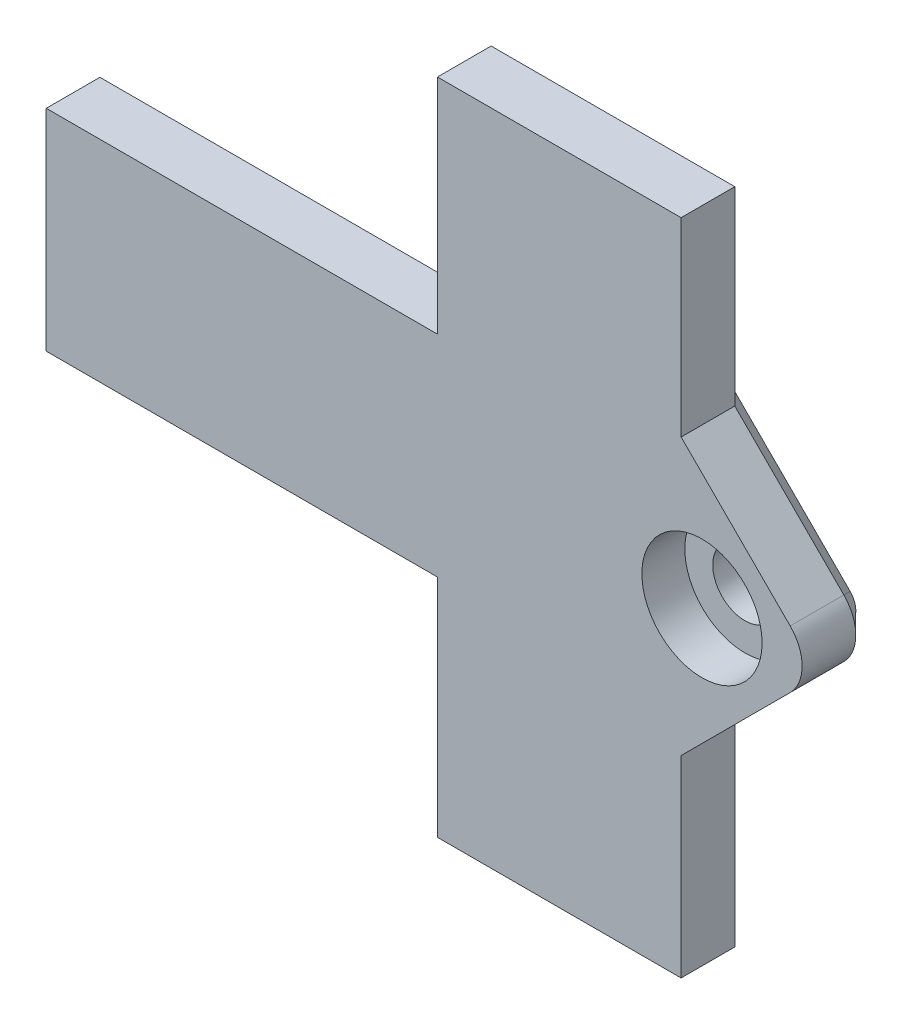
ISO-10303-21;
HEADER;
FILE_DESCRIPTION(('STEP AP214'),'2;1');
FILE_NAME('part.step','',(''),(''),'','','');
FILE_SCHEMA(('AUTOMOTIVE_DESIGN { 1 0 10303 214 1 1 1 1 }'));
ENDSEC;
DATA;
#1=APPLICATION_CONTEXT('core data for automotive mechanical design processes');
#2=APPLICATION_PROTOCOL_DEFINITION('international standard','automotive_design',2000,#1);
#3=PRODUCT_CONTEXT('',#1,'mechanical');
#4=PRODUCT('Part','Part','',(#3));
#5=PRODUCT_RELATED_PRODUCT_CATEGORY('part','',(#4));
#6=PRODUCT_DEFINITION_FORMATION('','',#4);
#7=PRODUCT_DEFINITION_CONTEXT('part definition',#1,'design');
#8=PRODUCT_DEFINITION('design','',#6,#7);
#9=PRODUCT_DEFINITION_SHAPE('','',#8);
#10=(LENGTH_UNIT() NAMED_UNIT(*) SI_UNIT(.MILLI.,.METRE.));
#11=(NAMED_UNIT(*) PLANE_ANGLE_UNIT() SI_UNIT($,.RADIAN.));
#12=(NAMED_UNIT(*) SI_UNIT($,.STERADIAN.) SOLID_ANGLE_UNIT());
#13=UNCERTAINTY_MEASURE_WITH_UNIT(LENGTH_MEASURE(1.E-05),#10,'distance_accuracy_value','');
#14=(GEOMETRIC_REPRESENTATION_CONTEXT(3) GLOBAL_UNCERTAINTY_ASSIGNED_CONTEXT((#13)) GLOBAL_UNIT_ASSIGNED_CONTEXT((#10,
#11,#12)) REPRESENTATION_CONTEXT('',''));
#15=CARTESIAN_POINT('',(0.,0.,0.));
#16=DIRECTION('',(0.,0.,1.));
#17=DIRECTION('',(1.,0.,0.));
#18=AXIS2_PLACEMENT_3D('',#15,#16,#17);
#19=CARTESIAN_POINT('',(-23.9,-4.9,-50.2001693825472));
#20=DIRECTION('',(0.,-1.,0.));
#21=DIRECTION('',(1.,0.,0.));
#22=AXIS2_PLACEMENT_3D('',#19,#20,#21);
#23=PLANE('',#22);
#24=DIRECTION('',(0.,0.,1.));
#25=VECTOR('',#24,1.);
#26=CARTESIAN_POINT('',(-23.9,-4.9,-50.2001693825472));
#27=LINE('',#26,#25);
#28=CARTESIAN_POINT('',(-23.9,-4.9,-2.50000000000002));
#29=VERTEX_POINT('',#28);
#30=CARTESIAN_POINT('',(-23.9,-4.9,0.));
#31=VERTEX_POINT('',#30);
#32=EDGE_CURVE('E217',#29,#31,#27,.T.);
#33=ORIENTED_EDGE('',*,*,#32,.F.);
#34=DIRECTION('',(1.,0.,0.));
#35=VECTOR('',#34,1.);
#36=CARTESIAN_POINT('',(-23.9,-4.9,-2.50000000000002));
#37=LINE('',#36,#35);
#38=CARTESIAN_POINT('',(-19.3875,-4.9,-2.5));
#39=VERTEX_POINT('',#38);
#40=EDGE_CURVE('E303',#29,#39,#37,.T.);
#41=ORIENTED_EDGE('',*,*,#40,.T.);
#42=DIRECTION('',(0.,0.,-1.));
#43=VECTOR('',#42,1.);
#44=CARTESIAN_POINT('',(-19.3875,-4.9,-0.899999999999998));
#45=LINE('',#44,#43);
#46=CARTESIAN_POINT('',(-19.3875,-4.9,-0.899999999999998));
#47=VERTEX_POINT('',#46);
#48=EDGE_CURVE('E200',#47,#39,#45,.T.);
#49=ORIENTED_EDGE('',*,*,#48,.F.);
#50=DIRECTION('',(-1.,0.,0.));
#51=VECTOR('',#50,1.);
#52=CARTESIAN_POINT('',(-10.3875,-4.9,-0.9));
#53=LINE('',#52,#51);
#54=CARTESIAN_POINT('',(-10.3875,-4.9,-0.9));
#55=VERTEX_POINT('',#54);
#56=EDGE_CURVE('E182',#55,#47,#53,.T.);
#57=ORIENTED_EDGE('',*,*,#56,.F.);
#58=DIRECTION('',(0.,0.,1.));
#59=VECTOR('',#58,1.);
#60=CARTESIAN_POINT('',(-10.3875,-4.9,-2.5));
#61=LINE('',#60,#59);
#62=CARTESIAN_POINT('',(-10.3875,-4.9,-2.5));
#63=VERTEX_POINT('',#62);
#64=EDGE_CURVE('E190',#63,#55,#61,.T.);
#65=ORIENTED_EDGE('',*,*,#64,.F.);
#66=DIRECTION('',(1.,0.,0.));
#67=VECTOR('',#66,1.);
#68=CARTESIAN_POINT('',(-23.9,-4.9,-2.50000000000002));
#69=LINE('',#68,#67);
#70=CARTESIAN_POINT('',(-5.675,-4.9,-2.50000000000002));
#71=VERTEX_POINT('',#70);
#72=EDGE_CURVE('E301',#63,#71,#69,.T.);
#73=ORIENTED_EDGE('',*,*,#72,.T.);
#74=DIRECTION('',(0.,0.,1.));
#75=VECTOR('',#74,1.);
#76=CARTESIAN_POINT('',(-5.675,-4.9,-50.2001693825472));
#77=LINE('',#76,#75);
#78=CARTESIAN_POINT('',(-5.675,-4.9,0.));
#79=VERTEX_POINT('',#78);
#80=EDGE_CURVE('E269',#71,#79,#77,.T.);
#81=ORIENTED_EDGE('',*,*,#80,.T.);
#82=DIRECTION('',(1.,0.,0.));
#83=VECTOR('',#82,1.);
#84=CARTESIAN_POINT('',(-23.9,-4.9,0.));
#85=LINE('',#84,#83);
#86=EDGE_CURVE('E242',#31,#79,#85,.T.);
#87=ORIENTED_EDGE('',*,*,#86,.F.);
#88=EDGE_LOOP('',(#33,#41,#49,#57,#65,#73,#81,#87));
#89=FACE_BOUND('',#88,.T.);
#90=ADVANCED_FACE('F33',(#89),#23,.T.);
#91=CARTESIAN_POINT('',(9.41292653782974,0.,-3.5));
#92=DIRECTION('',(0.,0.,-1.));
#93=DIRECTION('',(0.,1.,0.));
#94=AXIS2_PLACEMENT_3D('',#91,#92,#93);
#95=PLANE('',#94);
#96=CARTESIAN_POINT('',(6.64722001237515,0.,-3.5));
#97=DIRECTION('',(0.,0.,1.));
#98=DIRECTION('',(1.,0.,0.));
#99=AXIS2_PLACEMENT_3D('',#96,#97,#98);
#100=CIRCLE('',#99,1.5);
#101=CARTESIAN_POINT('',(8.14722001237515,0.,-3.5));
#102=VERTEX_POINT('',#101);
#103=EDGE_CURVE('E364',#102,#102,#100,.T.);
#104=ORIENTED_EDGE('',*,*,#103,.T.);
#105=EDGE_LOOP('',(#104));
#106=FACE_BOUND('',#105,.T.);
#107=DIRECTION('',(-1.,0.,0.));
#108=VECTOR('',#107,1.);
#109=CARTESIAN_POINT('',(9.41292653782974,-3.9,-3.5));
#110=LINE('',#109,#108);
#111=CARTESIAN_POINT('',(-4.675,-3.9,-3.5));
#112=VERTEX_POINT('',#111);
#113=CARTESIAN_POINT('',(-22.9,-3.90000000000001,-3.5));
#114=VERTEX_POINT('',#113);
#115=EDGE_CURVE('E296',#112,#114,#110,.T.);
#116=ORIENTED_EDGE('',*,*,#115,.T.);
#117=DIRECTION('',(0.,1.,0.));
#118=VECTOR('',#117,1.);
#119=CARTESIAN_POINT('',(-22.9,0.,-3.5));
#120=LINE('',#119,#118);
#121=CARTESIAN_POINT('',(-22.9,3.90000000000001,-3.5));
#122=VERTEX_POINT('',#121);
#123=EDGE_CURVE('E298',#114,#122,#120,.T.);
#124=ORIENTED_EDGE('',*,*,#123,.T.);
#125=DIRECTION('',(1.,0.,0.));
#126=VECTOR('',#125,1.);
#127=CARTESIAN_POINT('',(9.41292653782974,3.90000000000002,-3.5));
#128=LINE('',#127,#126);
#129=CARTESIAN_POINT('',(-4.67500000000001,3.90000000000001,-3.5));
#130=VERTEX_POINT('',#129);
#131=EDGE_CURVE('E276',#122,#130,#128,.T.);
#132=ORIENTED_EDGE('',*,*,#131,.T.);
#133=DIRECTION('',(0.,1.,0.));
#134=VECTOR('',#133,1.);
#135=CARTESIAN_POINT('',(-4.67500000000001,0.,-3.5));
#136=LINE('',#135,#134);
#137=CARTESIAN_POINT('',(-4.67500000000001,14.275,-3.5));
#138=VERTEX_POINT('',#137);
#139=EDGE_CURVE('E278',#130,#138,#136,.T.);
#140=ORIENTED_EDGE('',*,*,#139,.T.);
#141=DIRECTION('',(1.,0.,0.));
#142=VECTOR('',#141,1.);
#143=CARTESIAN_POINT('',(9.41292653782974,14.275,-3.5));
#144=LINE('',#143,#142);
#145=CARTESIAN_POINT('',(4.67500000000001,14.275,-3.5));
#146=VERTEX_POINT('',#145);
#147=EDGE_CURVE('E280',#138,#146,#144,.T.);
#148=ORIENTED_EDGE('',*,*,#147,.T.);
#149=DIRECTION('',(0.,-1.,0.));
#150=VECTOR('',#149,1.);
#151=CARTESIAN_POINT('',(4.675,0.,-3.5));
#152=LINE('',#151,#150);
#153=CARTESIAN_POINT('',(4.67500000000001,6.01071874396554,-3.5));
#154=VERTEX_POINT('',#153);
#155=EDGE_CURVE('E282',#146,#154,#152,.T.);
#156=ORIENTED_EDGE('',*,*,#155,.T.);
#157=DIRECTION('',(0.707106781186547,-0.707106781186548,0.));
#158=VECTOR('',#157,1.);
#159=CARTESIAN_POINT('',(10.0493226408976,0.636396103067898,-3.5));
#160=LINE('',#159,#158);
#161=CARTESIAN_POINT('',(10.0493226408976,0.636396103067898,-3.5));
#162=VERTEX_POINT('',#161);
#163=EDGE_CURVE('E284',#154,#162,#160,.T.);
#164=ORIENTED_EDGE('',*,*,#163,.T.);
#165=CARTESIAN_POINT('',(9.41292653782974,0.,-3.5));
#166=DIRECTION('',(0.,0.,-1.));
#167=DIRECTION('',(-1.,0.,0.));
#168=AXIS2_PLACEMENT_3D('',#165,#166,#167);
#169=CIRCLE('',#168,0.900000000000011);
#170=CARTESIAN_POINT('',(10.0493226408976,-0.6363961030679,-3.5));
#171=VERTEX_POINT('',#170);
#172=EDGE_CURVE('E286',#162,#171,#169,.T.);
#173=ORIENTED_EDGE('',*,*,#172,.T.);
#174=DIRECTION('',(-0.707106781186547,-0.707106781186548,0.));
#175=VECTOR('',#174,1.);
#176=CARTESIAN_POINT('',(10.0493226408976,-0.636396103067899,-3.5));
#177=LINE('',#176,#175);
#178=CARTESIAN_POINT('',(4.67500000000001,-6.01071874396554,-3.5));
#179=VERTEX_POINT('',#178);
#180=EDGE_CURVE('E288',#171,#179,#177,.T.);
#181=ORIENTED_EDGE('',*,*,#180,.T.);
#182=DIRECTION('',(0.,-1.,0.));
#183=VECTOR('',#182,1.);
#184=CARTESIAN_POINT('',(4.675,0.,-3.5));
#185=LINE('',#184,#183);
#186=CARTESIAN_POINT('',(4.67500000000001,-14.4,-3.5));
#187=VERTEX_POINT('',#186);
#188=EDGE_CURVE('E290',#179,#187,#185,.T.);
#189=ORIENTED_EDGE('',*,*,#188,.T.);
#190=DIRECTION('',(-1.,0.,0.));
#191=VECTOR('',#190,1.);
#192=CARTESIAN_POINT('',(9.41292653782975,-14.4,-3.5));
#193=LINE('',#192,#191);
#194=CARTESIAN_POINT('',(-4.675,-14.4,-3.5));
#195=VERTEX_POINT('',#194);
#196=EDGE_CURVE('E292',#187,#195,#193,.T.);
#197=ORIENTED_EDGE('',*,*,#196,.T.);
#198=DIRECTION('',(0.,1.,0.));
#199=VECTOR('',#198,1.);
#200=CARTESIAN_POINT('',(-4.675,0.,-3.5));
#201=LINE('',#200,#199);
#202=EDGE_CURVE('E294',#195,#112,#201,.T.);
#203=ORIENTED_EDGE('',*,*,#202,.T.);
#204=EDGE_LOOP('',(#116,#124,#132,#140,#148,#156,#164,#173,#181,#189,#197,#203));
#205=FACE_BOUND('',#204,.T.);
#206=ADVANCED_FACE('F392',(#106,#205),#95,.T.);
#207=CARTESIAN_POINT('',(9.41292653782974,0.,0.));
#208=DIRECTION('',(0.,0.,1.));
#209=DIRECTION('',(1.,0.,0.));
#210=AXIS2_PLACEMENT_3D('',#207,#208,#209);
#211=PLANE('',#210);
#212=CARTESIAN_POINT('',(6.64722001237515,0.,0.));
#213=DIRECTION('',(0.,0.,1.));
#214=DIRECTION('',(1.,0.,0.));
#215=AXIS2_PLACEMENT_3D('',#212,#213,#214);
#216=CIRCLE('',#215,2.8);
#217=CARTESIAN_POINT('',(9.44722001237515,0.,0.));
#218=VERTEX_POINT('',#217);
#219=EDGE_CURVE('E353',#218,#218,#216,.T.);
#220=ORIENTED_EDGE('',*,*,#219,.F.);
#221=EDGE_LOOP('',(#220));
#222=FACE_BOUND('',#221,.T.);
#223=DIRECTION('',(-1.,0.,0.));
#224=VECTOR('',#223,1.);
#225=CARTESIAN_POINT('',(-5.675,4.90000000000001,0.));
#226=LINE('',#225,#224);
#227=CARTESIAN_POINT('',(-5.675,4.90000000000001,0.));
#228=VERTEX_POINT('',#227);
#229=CARTESIAN_POINT('',(-23.9,4.9,0.));
#230=VERTEX_POINT('',#229);
#231=EDGE_CURVE('E213',#228,#230,#226,.T.);
#232=ORIENTED_EDGE('',*,*,#231,.T.);
#233=DIRECTION('',(0.,-1.,0.));
#234=VECTOR('',#233,1.);
#235=CARTESIAN_POINT('',(-23.9,4.9,0.));
#236=LINE('',#235,#234);
#237=EDGE_CURVE('E245',#230,#31,#236,.T.);
#238=ORIENTED_EDGE('',*,*,#237,.T.);
#239=ORIENTED_EDGE('',*,*,#86,.T.);
#240=DIRECTION('',(0.,-1.,0.));
#241=VECTOR('',#240,1.);
#242=CARTESIAN_POINT('',(-5.675,-4.9,0.));
#243=LINE('',#242,#241);
#244=CARTESIAN_POINT('',(-5.675,-15.4,0.));
#245=VERTEX_POINT('',#244);
#246=EDGE_CURVE('E239',#79,#245,#243,.T.);
#247=ORIENTED_EDGE('',*,*,#246,.T.);
#248=DIRECTION('',(1.,0.,0.));
#249=VECTOR('',#248,1.);
#250=CARTESIAN_POINT('',(-5.675,-15.4,0.));
#251=LINE('',#250,#249);
#252=CARTESIAN_POINT('',(5.675,-15.4,0.));
#253=VERTEX_POINT('',#252);
#254=EDGE_CURVE('E236',#245,#253,#251,.T.);
#255=ORIENTED_EDGE('',*,*,#254,.T.);
#256=DIRECTION('',(0.,1.,0.));
#257=VECTOR('',#256,1.);
#258=CARTESIAN_POINT('',(5.675,-15.4,0.));
#259=LINE('',#258,#257);
#260=CARTESIAN_POINT('',(5.675,-6.42493230633863,0.));
#261=VERTEX_POINT('',#260);
#262=EDGE_CURVE('E233',#253,#261,#259,.T.);
#263=ORIENTED_EDGE('',*,*,#262,.T.);
#264=DIRECTION('',(0.707106781186547,0.707106781186548,0.));
#265=VECTOR('',#264,1.);
#266=CARTESIAN_POINT('',(5.675,-6.42493230633863,0.));
#267=LINE('',#266,#265);
#268=CARTESIAN_POINT('',(10.7564294220842,-1.34350288425444,0.));
#269=VERTEX_POINT('',#268);
#270=EDGE_CURVE('E230',#261,#269,#267,.T.);
#271=ORIENTED_EDGE('',*,*,#270,.T.);
#272=CARTESIAN_POINT('',(9.41292653782974,0.,0.));
#273=DIRECTION('',(0.,0.,1.));
#274=DIRECTION('',(1.,0.,0.));
#275=AXIS2_PLACEMENT_3D('',#272,#273,#274);
#276=CIRCLE('',#275,1.9);
#277=CARTESIAN_POINT('',(10.7564294220842,1.34350288425444,0.));
#278=VERTEX_POINT('',#277);
#279=EDGE_CURVE('E227',#269,#278,#276,.T.);
#280=ORIENTED_EDGE('',*,*,#279,.T.);
#281=DIRECTION('',(-0.707106781186547,0.707106781186548,0.));
#282=VECTOR('',#281,1.);
#283=CARTESIAN_POINT('',(10.7564294220842,1.34350288425444,0.));
#284=LINE('',#283,#282);
#285=CARTESIAN_POINT('',(5.675,6.42493230633863,0.));
#286=VERTEX_POINT('',#285);
#287=EDGE_CURVE('E224',#278,#286,#284,.T.);
#288=ORIENTED_EDGE('',*,*,#287,.T.);
#289=DIRECTION('',(0.,1.,0.));
#290=VECTOR('',#289,1.);
#291=CARTESIAN_POINT('',(5.675,6.42493230633863,0.));
#292=LINE('',#291,#290);
#293=CARTESIAN_POINT('',(5.675,15.275,0.));
#294=VERTEX_POINT('',#293);
#295=EDGE_CURVE('E221',#286,#294,#292,.T.);
#296=ORIENTED_EDGE('',*,*,#295,.T.);
#297=DIRECTION('',(-1.,0.,0.));
#298=VECTOR('',#297,1.);
#299=CARTESIAN_POINT('',(5.675,15.275,0.));
#300=LINE('',#299,#298);
#301=CARTESIAN_POINT('',(-5.675,15.275,0.));
#302=VERTEX_POINT('',#301);
#303=EDGE_CURVE('E218',#294,#302,#300,.T.);
#304=ORIENTED_EDGE('',*,*,#303,.T.);
#305=DIRECTION('',(0.,-1.,0.));
#306=VECTOR('',#305,1.);
#307=CARTESIAN_POINT('',(-5.675,15.275,0.));
#308=LINE('',#307,#306);
#309=EDGE_CURVE('E214',#302,#228,#308,.T.);
#310=ORIENTED_EDGE('',*,*,#309,.T.);
#311=EDGE_LOOP('',(#232,#238,#239,#247,#255,#263,#271,#280,#288,#296,#304,#310));
#312=FACE_BOUND('',#311,.T.);
#313=ADVANCED_FACE('F397',(#222,#312),#211,.T.);
#314=CARTESIAN_POINT('',(-23.9,4.9,-50.2001693825472));
#315=DIRECTION('',(-1.,0.,0.));
#316=DIRECTION('',(0.,-1.,0.));
#317=AXIS2_PLACEMENT_3D('',#314,#315,#316);
#318=PLANE('',#317);
#319=DIRECTION('',(0.,0.,1.));
#320=VECTOR('',#319,1.);
#321=CARTESIAN_POINT('',(-23.9,4.9,-50.2001693825472));
#322=LINE('',#321,#320);
#323=CARTESIAN_POINT('',(-23.9,4.9,-2.50000000000002));
#324=VERTEX_POINT('',#323);
#325=EDGE_CURVE('E252',#324,#230,#322,.T.);
#326=ORIENTED_EDGE('',*,*,#325,.F.);
#327=DIRECTION('',(0.,-1.,0.));
#328=VECTOR('',#327,1.);
#329=CARTESIAN_POINT('',(-23.9,4.9,-2.50000000000002));
#330=LINE('',#329,#328);
#331=EDGE_CURVE('E273',#324,#29,#330,.T.);
#332=ORIENTED_EDGE('',*,*,#331,.T.);
#333=ORIENTED_EDGE('',*,*,#32,.T.);
#334=ORIENTED_EDGE('',*,*,#237,.F.);
#335=EDGE_LOOP('',(#326,#332,#333,#334));
#336=FACE_BOUND('',#335,.T.);
#337=ADVANCED_FACE('F403',(#336),#318,.T.);
#338=CARTESIAN_POINT('',(-5.675,-4.9,-50.2001693825472));
#339=DIRECTION('',(-1.,0.,0.));
#340=DIRECTION('',(0.,-1.,0.));
#341=AXIS2_PLACEMENT_3D('',#338,#339,#340);
#342=PLANE('',#341);
#343=ORIENTED_EDGE('',*,*,#80,.F.);
#344=DIRECTION('',(0.,-1.,0.));
#345=VECTOR('',#344,1.);
#346=CARTESIAN_POINT('',(-5.675,-4.9,-2.50000000000002));
#347=LINE('',#346,#345);
#348=CARTESIAN_POINT('',(-5.675,-15.4,-2.50000000000002));
#349=VERTEX_POINT('',#348);
#350=EDGE_CURVE('E305',#71,#349,#347,.T.);
#351=ORIENTED_EDGE('',*,*,#350,.T.);
#352=DIRECTION('',(0.,0.,1.));
#353=VECTOR('',#352,1.);
#354=CARTESIAN_POINT('',(-5.675,-15.4,-50.2001693825472));
#355=LINE('',#354,#353);
#356=EDGE_CURVE('E267',#349,#245,#355,.T.);
#357=ORIENTED_EDGE('',*,*,#356,.T.);
#358=ORIENTED_EDGE('',*,*,#246,.F.);
#359=EDGE_LOOP('',(#343,#351,#357,#358));
#360=FACE_BOUND('',#359,.T.);
#361=ADVANCED_FACE('F401',(#360),#342,.T.);
#362=CARTESIAN_POINT('',(-5.675,-15.4,-50.2001693825472));
#363=DIRECTION('',(0.,-1.,0.));
#364=DIRECTION('',(1.,0.,0.));
#365=AXIS2_PLACEMENT_3D('',#362,#363,#364);
#366=PLANE('',#365);
#367=ORIENTED_EDGE('',*,*,#356,.F.);
#368=DIRECTION('',(1.,0.,0.));
#369=VECTOR('',#368,1.);
#370=CARTESIAN_POINT('',(-5.675,-15.4,-2.50000000000002));
#371=LINE('',#370,#369);
#372=CARTESIAN_POINT('',(5.675,-15.4,-2.50000000000002));
#373=VERTEX_POINT('',#372);
#374=EDGE_CURVE('E307',#349,#373,#371,.T.);
#375=ORIENTED_EDGE('',*,*,#374,.T.);
#376=DIRECTION('',(0.,0.,1.));
#377=VECTOR('',#376,1.);
#378=CARTESIAN_POINT('',(5.675,-15.4,-50.2001693825472));
#379=LINE('',#378,#377);
#380=EDGE_CURVE('E265',#373,#253,#379,.T.);
#381=ORIENTED_EDGE('',*,*,#380,.T.);
#382=ORIENTED_EDGE('',*,*,#254,.F.);
#383=EDGE_LOOP('',(#367,#375,#381,#382));
#384=FACE_BOUND('',#383,.T.);
#385=ADVANCED_FACE('F534',(#384),#366,.T.);
#386=CARTESIAN_POINT('',(5.675,-15.4,-50.2001693825472));
#387=DIRECTION('',(1.,0.,0.));
#388=DIRECTION('',(0.,1.,0.));
#389=AXIS2_PLACEMENT_3D('',#386,#387,#388);
#390=PLANE('',#389);
#391=ORIENTED_EDGE('',*,*,#380,.F.);
#392=DIRECTION('',(0.,1.,0.));
#393=VECTOR('',#392,1.);
#394=CARTESIAN_POINT('',(5.675,-15.4,-2.50000000000002));
#395=LINE('',#394,#393);
#396=CARTESIAN_POINT('',(5.675,-6.42493230633863,-2.50000000000002));
#397=VERTEX_POINT('',#396);
#398=EDGE_CURVE('E309',#373,#397,#395,.T.);
#399=ORIENTED_EDGE('',*,*,#398,.T.);
#400=DIRECTION('',(0.,0.,1.));
#401=VECTOR('',#400,1.);
#402=CARTESIAN_POINT('',(5.675,-6.42493230633863,-50.2001693825472));
#403=LINE('',#402,#401);
#404=EDGE_CURVE('E263',#397,#261,#403,.T.);
#405=ORIENTED_EDGE('',*,*,#404,.T.);
#406=ORIENTED_EDGE('',*,*,#262,.F.);
#407=EDGE_LOOP('',(#391,#399,#405,#406));
#408=FACE_BOUND('',#407,.T.);
#409=ADVANCED_FACE('F532',(#408),#390,.T.);
#410=CARTESIAN_POINT('',(5.675,-6.42493230633863,-50.2001693825472));
#411=DIRECTION('',(0.707106781186548,-0.707106781186547,0.));
#412=DIRECTION('',(0.707106781186547,0.707106781186548,0.));
#413=AXIS2_PLACEMENT_3D('',#410,#411,#412);
#414=PLANE('',#413);
#415=ORIENTED_EDGE('',*,*,#404,.F.);
#416=DIRECTION('',(0.707106781186547,0.707106781186548,0.));
#417=VECTOR('',#416,1.);
#418=CARTESIAN_POINT('',(5.675,-6.42493230633863,-2.50000000000002));
#419=LINE('',#418,#417);
#420=CARTESIAN_POINT('',(10.7564294220842,-1.34350288425444,-2.50000000000002));
#421=VERTEX_POINT('',#420);
#422=EDGE_CURVE('E311',#397,#421,#419,.T.);
#423=ORIENTED_EDGE('',*,*,#422,.T.);
#424=DIRECTION('',(0.,0.,1.));
#425=VECTOR('',#424,1.);
#426=CARTESIAN_POINT('',(10.7564294220842,-1.34350288425444,-50.2001693825472));
#427=LINE('',#426,#425);
#428=EDGE_CURVE('E261',#421,#269,#427,.T.);
#429=ORIENTED_EDGE('',*,*,#428,.T.);
#430=ORIENTED_EDGE('',*,*,#270,.F.);
#431=EDGE_LOOP('',(#415,#423,#429,#430));
#432=FACE_BOUND('',#431,.T.);
#433=ADVANCED_FACE('F486',(#432),#414,.T.);
#434=CARTESIAN_POINT('',(9.41292653782974,0.,-50.2001693825472));
#435=DIRECTION('',(0.,0.,1.));
#436=DIRECTION('',(1.,0.,0.));
#437=AXIS2_PLACEMENT_3D('',#434,#435,#436);
#438=CYLINDRICAL_SURFACE('',#437,1.9);
#439=ORIENTED_EDGE('',*,*,#428,.F.);
#440=CARTESIAN_POINT('',(9.41292653782974,0.,-2.50000000000002));
#441=DIRECTION('',(0.,0.,-1.));
#442=DIRECTION('',(-1.,0.,0.));
#443=AXIS2_PLACEMENT_3D('',#440,#441,#442);
#444=CIRCLE('',#443,1.9);
#445=CARTESIAN_POINT('',(10.7564294220842,1.34350288425444,-2.50000000000002));
#446=VERTEX_POINT('',#445);
#447=EDGE_CURVE('E313',#421,#446,#444,.F.);
#448=ORIENTED_EDGE('',*,*,#447,.T.);
#449=DIRECTION('',(0.,0.,1.));
#450=VECTOR('',#449,1.);
#451=CARTESIAN_POINT('',(10.7564294220842,1.34350288425444,-50.2001693825472));
#452=LINE('',#451,#450);
#453=EDGE_CURVE('E259',#446,#278,#452,.T.);
#454=ORIENTED_EDGE('',*,*,#453,.T.);
#455=ORIENTED_EDGE('',*,*,#279,.F.);
#456=EDGE_LOOP('',(#439,#448,#454,#455));
#457=FACE_BOUND('',#456,.T.);
#458=ADVANCED_FACE('F482',(#457),#438,.T.);
#459=CARTESIAN_POINT('',(10.7564294220842,1.34350288425444,-50.2001693825472));
#460=DIRECTION('',(0.707106781186548,0.707106781186547,0.));
#461=DIRECTION('',(-0.707106781186547,0.707106781186548,0.));
#462=AXIS2_PLACEMENT_3D('',#459,#460,#461);
#463=PLANE('',#462);
#464=ORIENTED_EDGE('',*,*,#453,.F.);
#465=DIRECTION('',(-0.707106781186547,0.707106781186548,0.));
#466=VECTOR('',#465,1.);
#467=CARTESIAN_POINT('',(10.7564294220842,1.34350288425444,-2.50000000000002));
#468=LINE('',#467,#466);
#469=CARTESIAN_POINT('',(5.675,6.42493230633863,-2.50000000000002));
#470=VERTEX_POINT('',#469);
#471=EDGE_CURVE('E315',#446,#470,#468,.T.);
#472=ORIENTED_EDGE('',*,*,#471,.T.);
#473=DIRECTION('',(0.,0.,1.));
#474=VECTOR('',#473,1.);
#475=CARTESIAN_POINT('',(5.675,6.42493230633863,-50.2001693825472));
#476=LINE('',#475,#474);
#477=EDGE_CURVE('E257',#470,#286,#476,.T.);
#478=ORIENTED_EDGE('',*,*,#477,.T.);
#479=ORIENTED_EDGE('',*,*,#287,.F.);
#480=EDGE_LOOP('',(#464,#472,#478,#479));
#481=FACE_BOUND('',#480,.T.);
#482=ADVANCED_FACE('F479',(#481),#463,.T.);
#483=CARTESIAN_POINT('',(5.675,6.42493230633863,-50.2001693825472));
#484=DIRECTION('',(1.,0.,0.));
#485=DIRECTION('',(0.,1.,0.));
#486=AXIS2_PLACEMENT_3D('',#483,#484,#485);
#487=PLANE('',#486);
#488=ORIENTED_EDGE('',*,*,#477,.F.);
#489=DIRECTION('',(0.,1.,0.));
#490=VECTOR('',#489,1.);
#491=CARTESIAN_POINT('',(5.675,6.42493230633863,-2.50000000000002));
#492=LINE('',#491,#490);
#493=CARTESIAN_POINT('',(5.675,15.275,-2.50000000000002));
#494=VERTEX_POINT('',#493);
#495=EDGE_CURVE('E317',#470,#494,#492,.T.);
#496=ORIENTED_EDGE('',*,*,#495,.T.);
#497=DIRECTION('',(0.,0.,1.));
#498=VECTOR('',#497,1.);
#499=CARTESIAN_POINT('',(5.675,15.275,-50.2001693825472));
#500=LINE('',#499,#498);
#501=EDGE_CURVE('E255',#494,#294,#500,.T.);
#502=ORIENTED_EDGE('',*,*,#501,.T.);
#503=ORIENTED_EDGE('',*,*,#295,.F.);
#504=EDGE_LOOP('',(#488,#496,#502,#503));
#505=FACE_BOUND('',#504,.T.);
#506=ADVANCED_FACE('F469',(#505),#487,.T.);
#507=CARTESIAN_POINT('',(5.675,15.275,-50.2001693825472));
#508=DIRECTION('',(0.,1.,0.));
#509=DIRECTION('',(-1.,0.,0.));
#510=AXIS2_PLACEMENT_3D('',#507,#508,#509);
#511=PLANE('',#510);
#512=ORIENTED_EDGE('',*,*,#501,.F.);
#513=DIRECTION('',(-1.,0.,0.));
#514=VECTOR('',#513,1.);
#515=CARTESIAN_POINT('',(5.675,15.275,-2.50000000000002));
#516=LINE('',#515,#514);
#517=CARTESIAN_POINT('',(-5.675,15.275,-2.50000000000002));
#518=VERTEX_POINT('',#517);
#519=EDGE_CURVE('E57',#494,#518,#516,.T.);
#520=ORIENTED_EDGE('',*,*,#519,.T.);
#521=DIRECTION('',(0.,0.,1.));
#522=VECTOR('',#521,1.);
#523=CARTESIAN_POINT('',(-5.675,15.275,-50.2001693825472));
#524=LINE('',#523,#522);
#525=EDGE_CURVE('E253',#518,#302,#524,.T.);
#526=ORIENTED_EDGE('',*,*,#525,.T.);
#527=ORIENTED_EDGE('',*,*,#303,.F.);
#528=EDGE_LOOP('',(#512,#520,#526,#527));
#529=FACE_BOUND('',#528,.T.);
#530=ADVANCED_FACE('F472',(#529),#511,.T.);
#531=CARTESIAN_POINT('',(-5.675,15.275,-50.2001693825472));
#532=DIRECTION('',(-1.,0.,0.));
#533=DIRECTION('',(0.,-1.,0.));
#534=AXIS2_PLACEMENT_3D('',#531,#532,#533);
#535=PLANE('',#534);
#536=ORIENTED_EDGE('',*,*,#525,.F.);
#537=DIRECTION('',(0.,-1.,0.));
#538=VECTOR('',#537,1.);
#539=CARTESIAN_POINT('',(-5.675,15.275,-2.50000000000002));
#540=LINE('',#539,#538);
#541=CARTESIAN_POINT('',(-5.675,4.90000000000001,-2.50000000000002));
#542=VERTEX_POINT('',#541);
#543=EDGE_CURVE('E42',#518,#542,#540,.T.);
#544=ORIENTED_EDGE('',*,*,#543,.T.);
#545=DIRECTION('',(0.,0.,1.));
#546=VECTOR('',#545,1.);
#547=CARTESIAN_POINT('',(-5.675,4.90000000000001,-50.2001693825472));
#548=LINE('',#547,#546);
#549=EDGE_CURVE('E250',#542,#228,#548,.T.);
#550=ORIENTED_EDGE('',*,*,#549,.T.);
#551=ORIENTED_EDGE('',*,*,#309,.F.);
#552=EDGE_LOOP('',(#536,#544,#550,#551));
#553=FACE_BOUND('',#552,.T.);
#554=ADVANCED_FACE('F513',(#553),#535,.T.);
#555=CARTESIAN_POINT('',(-5.675,4.90000000000001,-50.2001693825472));
#556=DIRECTION('',(0.,1.,0.));
#557=DIRECTION('',(-1.,0.,0.));
#558=AXIS2_PLACEMENT_3D('',#555,#556,#557);
#559=PLANE('',#558);
#560=ORIENTED_EDGE('',*,*,#549,.F.);
#561=DIRECTION('',(-1.,0.,0.));
#562=VECTOR('',#561,1.);
#563=CARTESIAN_POINT('',(-5.675,4.90000000000001,-2.50000000000002));
#564=LINE('',#563,#562);
#565=EDGE_CURVE('E11',#542,#324,#564,.T.);
#566=ORIENTED_EDGE('',*,*,#565,.T.);
#567=ORIENTED_EDGE('',*,*,#325,.T.);
#568=ORIENTED_EDGE('',*,*,#231,.F.);
#569=EDGE_LOOP('',(#560,#566,#567,#568));
#570=FACE_BOUND('',#569,.T.);
#571=ADVANCED_FACE('F509',(#570),#559,.T.);
#572=CARTESIAN_POINT('',(-10.3875,-4.9,-2.5));
#573=DIRECTION('',(0.707106781186546,-0.707106781186549,0.));
#574=DIRECTION('',(0.707106781186549,0.707106781186546,0.));
#575=AXIS2_PLACEMENT_3D('',#572,#573,#574);
#576=PLANE('',#575);
#577=ORIENTED_EDGE('',*,*,#64,.T.);
#578=DIRECTION('',(0.577350269189627,0.577350269189625,0.577350269189626));
#579=VECTOR('',#578,1.);
#580=CARTESIAN_POINT('',(-10.3875,-4.9,-0.9));
#581=LINE('',#580,#579);
#582=CARTESIAN_POINT('',(-11.1875,-5.69999999999999,-1.7));
#583=VERTEX_POINT('',#582);
#584=EDGE_CURVE('E177',#583,#55,#581,.T.);
#585=ORIENTED_EDGE('',*,*,#584,.F.);
#586=DIRECTION('',(0.577350269189626,0.577350269189624,-0.577350269189626));
#587=VECTOR('',#586,1.);
#588=CARTESIAN_POINT('',(-10.3875,-4.9,-2.5));
#589=LINE('',#588,#587);
#590=EDGE_CURVE('E192',#583,#63,#589,.T.);
#591=ORIENTED_EDGE('',*,*,#590,.T.);
#592=EDGE_LOOP('',(#577,#585,#591));
#593=FACE_BOUND('',#592,.T.);
#594=ADVANCED_FACE('F191',(#593),#576,.T.);
#595=CARTESIAN_POINT('',(-10.3875,-4.9,-0.9));
#596=DIRECTION('',(0.,-0.707106781186549,0.707106781186546));
#597=DIRECTION('',(0.,-0.707106781186546,-0.707106781186549));
#598=AXIS2_PLACEMENT_3D('',#595,#596,#597);
#599=PLANE('',#598);
#600=DIRECTION('',(-0.577350269189627,0.577350269189624,0.577350269189627));
#601=VECTOR('',#600,1.);
#602=CARTESIAN_POINT('',(-19.3875,-4.9,-0.899999999999998));
#603=LINE('',#602,#601);
#604=CARTESIAN_POINT('',(-18.5875,-5.69999999999999,-1.7));
#605=VERTEX_POINT('',#604);
#606=EDGE_CURVE('E187',#605,#47,#603,.T.);
#607=ORIENTED_EDGE('',*,*,#606,.F.);
#608=DIRECTION('',(1.,0.,0.));
#609=VECTOR('',#608,1.);
#610=CARTESIAN_POINT('',(-10.3875,-5.69999999999999,-1.7));
#611=LINE('',#610,#609);
#612=EDGE_CURVE('E184',#605,#583,#611,.T.);
#613=ORIENTED_EDGE('',*,*,#612,.T.);
#614=ORIENTED_EDGE('',*,*,#584,.T.);
#615=ORIENTED_EDGE('',*,*,#56,.T.);
#616=EDGE_LOOP('',(#607,#613,#614,#615));
#617=FACE_BOUND('',#616,.T.);
#618=ADVANCED_FACE('F180',(#617),#599,.T.);
#619=CARTESIAN_POINT('',(-19.3875,-4.9,-0.899999999999998));
#620=DIRECTION('',(-0.707106781186546,-0.707106781186549,0.));
#621=DIRECTION('',(0.707106781186549,-0.707106781186546,0.));
#622=AXIS2_PLACEMENT_3D('',#619,#620,#621);
#623=PLANE('',#622);
#624=ORIENTED_EDGE('',*,*,#48,.T.);
#625=DIRECTION('',(-0.577350269189627,0.577350269189624,-0.577350269189626));
#626=VECTOR('',#625,1.);
#627=CARTESIAN_POINT('',(-19.3875,-4.9,-2.5));
#628=LINE('',#627,#626);
#629=EDGE_CURVE('E208',#605,#39,#628,.T.);
#630=ORIENTED_EDGE('',*,*,#629,.F.);
#631=ORIENTED_EDGE('',*,*,#606,.T.);
#632=EDGE_LOOP('',(#624,#630,#631));
#633=FACE_BOUND('',#632,.T.);
#634=ADVANCED_FACE('F387',(#633),#623,.T.);
#635=CARTESIAN_POINT('',(-19.3875,-4.9,-2.5));
#636=DIRECTION('',(0.,-0.707106781186549,-0.707106781186546));
#637=DIRECTION('',(0.,0.707106781186546,-0.707106781186549));
#638=AXIS2_PLACEMENT_3D('',#635,#636,#637);
#639=PLANE('',#638);
#640=ORIENTED_EDGE('',*,*,#612,.F.);
#641=ORIENTED_EDGE('',*,*,#629,.T.);
#642=DIRECTION('',(1.,0.,0.));
#643=VECTOR('',#642,1.);
#644=CARTESIAN_POINT('',(-19.3875,-4.9,-2.5));
#645=LINE('',#644,#643);
#646=EDGE_CURVE('E202',#39,#63,#645,.T.);
#647=ORIENTED_EDGE('',*,*,#646,.T.);
#648=ORIENTED_EDGE('',*,*,#590,.F.);
#649=EDGE_LOOP('',(#640,#641,#647,#648));
#650=FACE_BOUND('',#649,.T.);
#651=ADVANCED_FACE('F382',(#650),#639,.T.);
#652=CARTESIAN_POINT('',(6.64722001237515,0.,-2.));
#653=DIRECTION('',(0.,0.,1.));
#654=DIRECTION('',(1.,0.,0.));
#655=AXIS2_PLACEMENT_3D('',#652,#653,#654);
#656=CYLINDRICAL_SURFACE('',#655,2.8);
#657=CARTESIAN_POINT('',(6.64722001237515,0.,-2.));
#658=DIRECTION('',(0.,0.,1.));
#659=DIRECTION('',(1.,0.,0.));
#660=AXIS2_PLACEMENT_3D('',#657,#658,#659);
#661=CIRCLE('',#660,2.8);
#662=CARTESIAN_POINT('',(9.44722001237515,0.,-2.));
#663=VERTEX_POINT('',#662);
#664=EDGE_CURVE('E196',#663,#663,#661,.T.);
#665=ORIENTED_EDGE('',*,*,#664,.F.);
#666=EDGE_LOOP('',(#665));
#667=FACE_BOUND('',#666,.T.);
#668=ORIENTED_EDGE('',*,*,#219,.T.);
#669=EDGE_LOOP('',(#668));
#670=FACE_BOUND('',#669,.T.);
#671=ADVANCED_FACE('F377',(#667,#670),#656,.F.);
#672=CARTESIAN_POINT('',(6.64722001237515,0.,-2.));
#673=DIRECTION('',(0.,0.,1.));
#674=DIRECTION('',(1.,0.,0.));
#675=AXIS2_PLACEMENT_3D('',#672,#673,#674);
#676=PLANE('',#675);
#677=CARTESIAN_POINT('',(6.64722001237515,0.,-2.));
#678=DIRECTION('',(0.,0.,1.));
#679=DIRECTION('',(1.,0.,0.));
#680=AXIS2_PLACEMENT_3D('',#677,#678,#679);
#681=CIRCLE('',#680,1.5);
#682=CARTESIAN_POINT('',(8.14722001237515,0.,-2.));
#683=VERTEX_POINT('',#682);
#684=EDGE_CURVE('E37',#683,#683,#681,.T.);
#685=ORIENTED_EDGE('',*,*,#684,.F.);
#686=EDGE_LOOP('',(#685));
#687=FACE_BOUND('',#686,.T.);
#688=ORIENTED_EDGE('',*,*,#664,.T.);
#689=EDGE_LOOP('',(#688));
#690=FACE_BOUND('',#689,.T.);
#691=ADVANCED_FACE('F374',(#687,#690),#676,.T.);
#692=CARTESIAN_POINT('',(9.41292653782974,0.,-2.50000000000002));
#693=DIRECTION('',(0.,0.,1.));
#694=DIRECTION('',(1.,0.,0.));
#695=AXIS2_PLACEMENT_3D('',#692,#693,#694);
#696=CONICAL_SURFACE('',#695,1.9,0.785398163397452);
#697=DIRECTION('',(0.500000000000002,-0.500000000000001,0.707106781186545));
#698=VECTOR('',#697,1.);
#699=CARTESIAN_POINT('',(10.0493226408976,-0.6363961030679,-3.5));
#700=LINE('',#699,#698);
#701=EDGE_CURVE('E349',#171,#421,#700,.T.);
#702=ORIENTED_EDGE('',*,*,#701,.F.);
#703=ORIENTED_EDGE('',*,*,#172,.F.);
#704=DIRECTION('',(-0.500000000000002,-0.500000000000001,-0.707106781186545));
#705=VECTOR('',#704,1.);
#706=CARTESIAN_POINT('',(10.7564294220842,1.34350288425444,-2.50000000000002));
#707=LINE('',#706,#705);
#708=EDGE_CURVE('E351',#446,#162,#707,.T.);
#709=ORIENTED_EDGE('',*,*,#708,.F.);
#710=ORIENTED_EDGE('',*,*,#447,.F.);
#711=EDGE_LOOP('',(#702,#703,#709,#710));
#712=FACE_BOUND('',#711,.T.);
#713=ADVANCED_FACE('F35',(#712),#696,.T.);
#714=CARTESIAN_POINT('',(10.7564294220842,1.34350288425444,-2.50000000000002));
#715=DIRECTION('',(-0.499999999999998,-0.499999999999997,0.707106781186551));
#716=DIRECTION('',(-0.707106781186547,0.707106781186548,0.));
#717=AXIS2_PLACEMENT_3D('',#714,#715,#716);
#718=PLANE('',#717);
#719=ORIENTED_EDGE('',*,*,#708,.T.);
#720=ORIENTED_EDGE('',*,*,#163,.F.);
#721=DIRECTION('',(-0.678598344545851,-0.281084637714821,-0.678598344545843));
#722=VECTOR('',#721,1.);
#723=CARTESIAN_POINT('',(7.04572647809131,6.99270580386796,-1.12927352190872));
#724=LINE('',#723,#722);
#725=EDGE_CURVE('E346',#470,#154,#724,.T.);
#726=ORIENTED_EDGE('',*,*,#725,.F.);
#727=ORIENTED_EDGE('',*,*,#471,.F.);
#728=EDGE_LOOP('',(#719,#720,#726,#727));
#729=FACE_BOUND('',#728,.T.);
#730=ADVANCED_FACE('F445',(#729),#718,.F.);
#731=CARTESIAN_POINT('',(5.675,-6.42493230633863,-2.50000000000002));
#732=DIRECTION('',(-0.499999999999998,0.499999999999997,0.707106781186551));
#733=DIRECTION('',(0.707106781186547,0.707106781186548,0.));
#734=AXIS2_PLACEMENT_3D('',#731,#732,#733);
#735=PLANE('',#734);
#736=ORIENTED_EDGE('',*,*,#701,.T.);
#737=ORIENTED_EDGE('',*,*,#422,.F.);
#738=DIRECTION('',(-0.678598344545851,0.28108463771482,-0.678598344545843));
#739=VECTOR('',#738,1.);
#740=CARTESIAN_POINT('',(7.38693645135979,-7.13403960241272,-0.788063548640245));
#741=LINE('',#740,#739);
#742=EDGE_CURVE('E343',#179,#397,#741,.F.);
#743=ORIENTED_EDGE('',*,*,#742,.F.);
#744=ORIENTED_EDGE('',*,*,#180,.F.);
#745=EDGE_LOOP('',(#736,#737,#743,#744));
#746=FACE_BOUND('',#745,.T.);
#747=ADVANCED_FACE('F442',(#746),#735,.F.);
#748=CARTESIAN_POINT('',(5.675,6.42493230633863,-2.50000000000002));
#749=DIRECTION('',(-0.707106781186544,0.,0.707106781186551));
#750=DIRECTION('',(0.,1.,0.));
#751=AXIS2_PLACEMENT_3D('',#748,#749,#750);
#752=PLANE('',#751);
#753=ORIENTED_EDGE('',*,*,#725,.T.);
#754=ORIENTED_EDGE('',*,*,#155,.F.);
#755=DIRECTION('',(-0.577350269189628,-0.577350269189628,-0.577350269189622));
#756=VECTOR('',#755,1.);
#757=CARTESIAN_POINT('',(5.675,15.275,-2.50000000000002));
#758=LINE('',#757,#756);
#759=EDGE_CURVE('E340',#494,#146,#758,.T.);
#760=ORIENTED_EDGE('',*,*,#759,.F.);
#761=ORIENTED_EDGE('',*,*,#495,.F.);
#762=EDGE_LOOP('',(#753,#754,#760,#761));
#763=FACE_BOUND('',#762,.T.);
#764=ADVANCED_FACE('F438',(#763),#752,.F.);
#765=CARTESIAN_POINT('',(5.675,-15.4,-2.50000000000002));
#766=DIRECTION('',(-0.707106781186544,0.,0.707106781186551));
#767=DIRECTION('',(0.,1.,0.));
#768=AXIS2_PLACEMENT_3D('',#765,#766,#767);
#769=PLANE('',#768);
#770=ORIENTED_EDGE('',*,*,#742,.T.);
#771=ORIENTED_EDGE('',*,*,#398,.F.);
#772=DIRECTION('',(-0.577350269189628,0.577350269189628,-0.577350269189622));
#773=VECTOR('',#772,1.);
#774=CARTESIAN_POINT('',(5.675,-15.4,-2.50000000000002));
#775=LINE('',#774,#773);
#776=EDGE_CURVE('E337',#187,#373,#775,.F.);
#777=ORIENTED_EDGE('',*,*,#776,.F.);
#778=ORIENTED_EDGE('',*,*,#188,.F.);
#779=EDGE_LOOP('',(#770,#771,#777,#778));
#780=FACE_BOUND('',#779,.T.);
#781=ADVANCED_FACE('F434',(#780),#769,.F.);
#782=CARTESIAN_POINT('',(5.675,15.275,-2.50000000000002));
#783=DIRECTION('',(0.,-0.707106781186544,0.707106781186551));
#784=DIRECTION('',(-1.,0.,0.));
#785=AXIS2_PLACEMENT_3D('',#782,#783,#784);
#786=PLANE('',#785);
#787=ORIENTED_EDGE('',*,*,#759,.T.);
#788=ORIENTED_EDGE('',*,*,#147,.F.);
#789=DIRECTION('',(0.577350269189627,-0.577350269189628,-0.577350269189622));
#790=VECTOR('',#789,1.);
#791=CARTESIAN_POINT('',(-5.675,15.275,-2.50000000000002));
#792=LINE('',#791,#790);
#793=EDGE_CURVE('E334',#518,#138,#792,.T.);
#794=ORIENTED_EDGE('',*,*,#793,.F.);
#795=ORIENTED_EDGE('',*,*,#519,.F.);
#796=EDGE_LOOP('',(#787,#788,#794,#795));
#797=FACE_BOUND('',#796,.T.);
#798=ADVANCED_FACE('F430',(#797),#786,.F.);
#799=CARTESIAN_POINT('',(-5.675,-15.4,-2.50000000000002));
#800=DIRECTION('',(0.,0.707106781186544,0.707106781186551));
#801=DIRECTION('',(1.,0.,0.));
#802=AXIS2_PLACEMENT_3D('',#799,#800,#801);
#803=PLANE('',#802);
#804=ORIENTED_EDGE('',*,*,#776,.T.);
#805=ORIENTED_EDGE('',*,*,#374,.F.);
#806=DIRECTION('',(0.577350269189628,0.577350269189628,-0.577350269189622));
#807=VECTOR('',#806,1.);
#808=CARTESIAN_POINT('',(-5.675,-15.4,-2.50000000000002));
#809=LINE('',#808,#807);
#810=EDGE_CURVE('E331',#195,#349,#809,.F.);
#811=ORIENTED_EDGE('',*,*,#810,.F.);
#812=ORIENTED_EDGE('',*,*,#196,.F.);
#813=EDGE_LOOP('',(#804,#805,#811,#812));
#814=FACE_BOUND('',#813,.T.);
#815=ADVANCED_FACE('F426',(#814),#803,.F.);
#816=CARTESIAN_POINT('',(-5.675,15.275,-2.50000000000002));
#817=DIRECTION('',(0.707106781186544,0.,0.707106781186551));
#818=DIRECTION('',(0.,-1.,0.));
#819=AXIS2_PLACEMENT_3D('',#816,#817,#818);
#820=PLANE('',#819);
#821=ORIENTED_EDGE('',*,*,#793,.T.);
#822=ORIENTED_EDGE('',*,*,#139,.F.);
#823=DIRECTION('',(0.577350269189627,-0.577350269189628,-0.577350269189622));
#824=VECTOR('',#823,1.);
#825=CARTESIAN_POINT('',(-9.13333333333335,8.35833333333336,0.958333333333305));
#826=LINE('',#825,#824);
#827=EDGE_CURVE('E328',#542,#130,#826,.T.);
#828=ORIENTED_EDGE('',*,*,#827,.F.);
#829=ORIENTED_EDGE('',*,*,#543,.F.);
#830=EDGE_LOOP('',(#821,#822,#828,#829));
#831=FACE_BOUND('',#830,.T.);
#832=ADVANCED_FACE('F422',(#831),#820,.F.);
#833=CARTESIAN_POINT('',(-5.675,-4.9,-2.50000000000002));
#834=DIRECTION('',(0.707106781186544,0.,0.707106781186551));
#835=DIRECTION('',(0.,-1.,0.));
#836=AXIS2_PLACEMENT_3D('',#833,#834,#835);
#837=PLANE('',#836);
#838=ORIENTED_EDGE('',*,*,#810,.T.);
#839=ORIENTED_EDGE('',*,*,#350,.F.);
#840=DIRECTION('',(0.577350269189628,0.577350269189628,-0.577350269189622));
#841=VECTOR('',#840,1.);
#842=CARTESIAN_POINT('',(-11.75,-10.975,3.57499999999996));
#843=LINE('',#842,#841);
#844=EDGE_CURVE('E325',#112,#71,#843,.F.);
#845=ORIENTED_EDGE('',*,*,#844,.F.);
#846=ORIENTED_EDGE('',*,*,#202,.F.);
#847=EDGE_LOOP('',(#838,#839,#845,#846));
#848=FACE_BOUND('',#847,.T.);
#849=ADVANCED_FACE('F418',(#848),#837,.F.);
#850=CARTESIAN_POINT('',(-5.675,4.90000000000001,-2.50000000000002));
#851=DIRECTION('',(0.,-0.707106781186544,0.707106781186551));
#852=DIRECTION('',(-1.,0.,0.));
#853=AXIS2_PLACEMENT_3D('',#850,#851,#852);
#854=PLANE('',#853);
#855=ORIENTED_EDGE('',*,*,#827,.T.);
#856=ORIENTED_EDGE('',*,*,#131,.F.);
#857=DIRECTION('',(-0.57735026918963,0.577350269189627,0.577350269189621));
#858=VECTOR('',#857,1.);
#859=CARTESIAN_POINT('',(-17.8249999999999,-1.17500000000005,-8.57500000000001));
#860=LINE('',#859,#858);
#861=EDGE_CURVE('E323',#324,#122,#860,.F.);
#862=ORIENTED_EDGE('',*,*,#861,.F.);
#863=ORIENTED_EDGE('',*,*,#565,.F.);
#864=EDGE_LOOP('',(#855,#856,#862,#863));
#865=FACE_BOUND('',#864,.T.);
#866=ADVANCED_FACE('F414',(#865),#854,.F.);
#867=CARTESIAN_POINT('',(-23.9,-4.9,-2.50000000000002));
#868=DIRECTION('',(0.,0.707106781186544,0.707106781186551));
#869=DIRECTION('',(1.,0.,0.));
#870=AXIS2_PLACEMENT_3D('',#867,#868,#869);
#871=PLANE('',#870);
#872=ORIENTED_EDGE('',*,*,#646,.F.);
#873=ORIENTED_EDGE('',*,*,#40,.F.);
#874=DIRECTION('',(0.57735026918963,0.577350269189627,-0.577350269189621));
#875=VECTOR('',#874,1.);
#876=CARTESIAN_POINT('',(-23.9,-4.9,-2.50000000000002));
#877=LINE('',#876,#875);
#878=EDGE_CURVE('E321',#114,#29,#877,.F.);
#879=ORIENTED_EDGE('',*,*,#878,.F.);
#880=ORIENTED_EDGE('',*,*,#115,.F.);
#881=ORIENTED_EDGE('',*,*,#844,.T.);
#882=ORIENTED_EDGE('',*,*,#72,.F.);
#883=EDGE_LOOP('',(#872,#873,#879,#880,#881,#882));
#884=FACE_BOUND('',#883,.T.);
#885=ADVANCED_FACE('F410',(#884),#871,.F.);
#886=CARTESIAN_POINT('',(-23.9,4.9,-2.50000000000002));
#887=DIRECTION('',(0.707106781186542,0.,0.707106781186553));
#888=DIRECTION('',(0.,-1.,0.));
#889=AXIS2_PLACEMENT_3D('',#886,#887,#888);
#890=PLANE('',#889);
#891=ORIENTED_EDGE('',*,*,#861,.T.);
#892=ORIENTED_EDGE('',*,*,#123,.F.);
#893=ORIENTED_EDGE('',*,*,#878,.T.);
#894=ORIENTED_EDGE('',*,*,#331,.F.);
#895=EDGE_LOOP('',(#891,#892,#893,#894));
#896=FACE_BOUND('',#895,.T.);
#897=ADVANCED_FACE('F407',(#896),#890,.F.);
#898=CARTESIAN_POINT('',(6.64722001237515,0.,-3.5));
#899=DIRECTION('',(0.,0.,1.));
#900=DIRECTION('',(1.,0.,0.));
#901=AXIS2_PLACEMENT_3D('',#898,#899,#900);
#902=CYLINDRICAL_SURFACE('',#901,1.5);
#903=ORIENTED_EDGE('',*,*,#684,.T.);
#904=EDGE_LOOP('',(#903));
#905=FACE_BOUND('',#904,.T.);
#906=ORIENTED_EDGE('',*,*,#103,.F.);
#907=EDGE_LOOP('',(#906));
#908=FACE_BOUND('',#907,.T.);
#909=ADVANCED_FACE('F371',(#905,#908),#902,.F.);
#910=CLOSED_SHELL('',(#90,#206,#313,#337,#361,#385,#409,#433,#458,#482,#506,#530,#554,#571,#594,
#618,#634,#651,#671,#691,#713,#730,#747,#764,#781,#798,#815,#832,#849,#866,#885,#897,#909));
#911=MANIFOLD_SOLID_BREP('B2',#910);
#912=ADVANCED_BREP_SHAPE_REPRESENTATION('',(#18,#911),#14);
#913=SHAPE_DEFINITION_REPRESENTATION(#9,#912);
ENDSEC;
END-ISO-10303-21;
